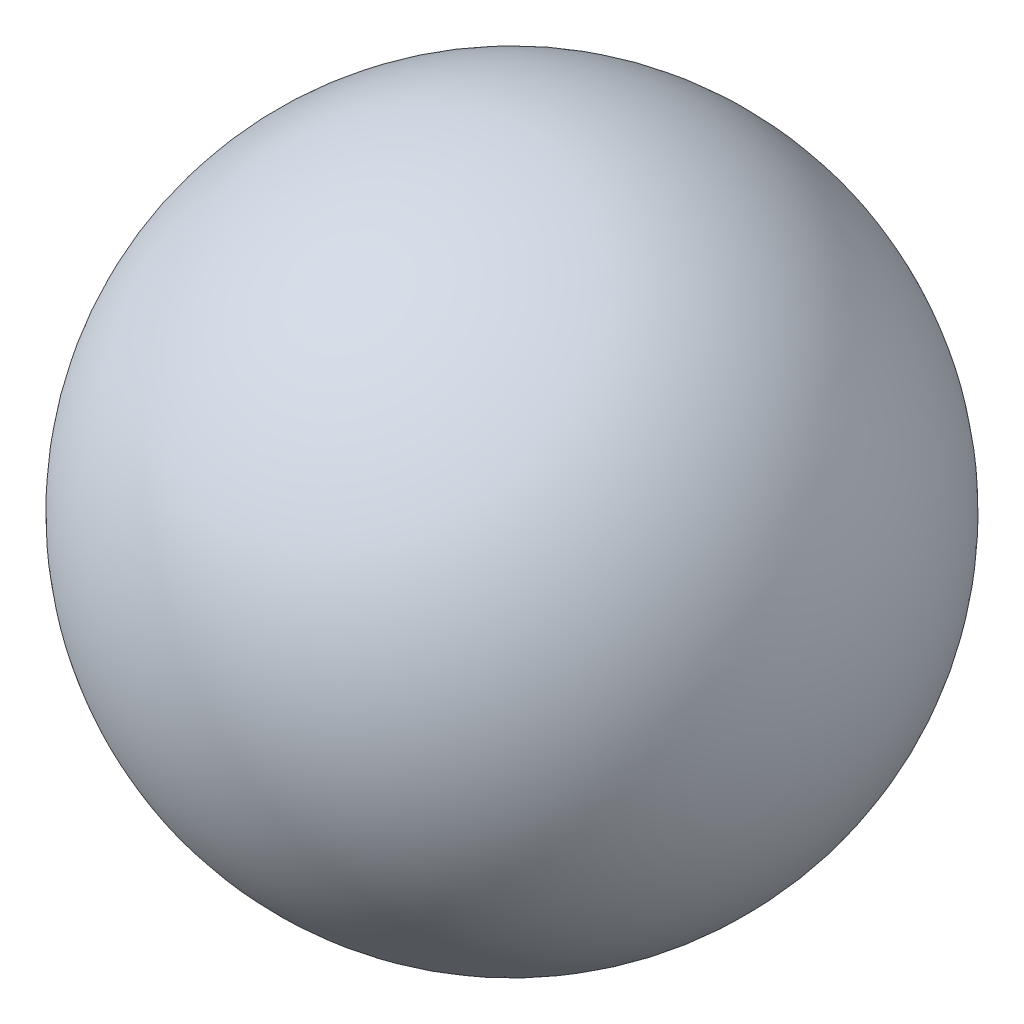
ISO-10303-21;
HEADER;
FILE_DESCRIPTION(('STEP AP214'),'2;1');
FILE_NAME('part.step','',(''),(''),'','','');
FILE_SCHEMA(('AUTOMOTIVE_DESIGN { 1 0 10303 214 1 1 1 1 }'));
ENDSEC;
DATA;
#1=APPLICATION_CONTEXT('core data for automotive mechanical design processes');
#2=APPLICATION_PROTOCOL_DEFINITION('international standard','automotive_design',2000,#1);
#3=PRODUCT_CONTEXT('',#1,'mechanical');
#4=PRODUCT('Part','Part','',(#3));
#5=PRODUCT_RELATED_PRODUCT_CATEGORY('part','',(#4));
#6=PRODUCT_DEFINITION_FORMATION('','',#4);
#7=PRODUCT_DEFINITION_CONTEXT('part definition',#1,'design');
#8=PRODUCT_DEFINITION('design','',#6,#7);
#9=PRODUCT_DEFINITION_SHAPE('','',#8);
#10=(LENGTH_UNIT() NAMED_UNIT(*) SI_UNIT(.MILLI.,.METRE.));
#11=(NAMED_UNIT(*) PLANE_ANGLE_UNIT() SI_UNIT($,.RADIAN.));
#12=(NAMED_UNIT(*) SI_UNIT($,.STERADIAN.) SOLID_ANGLE_UNIT());
#13=UNCERTAINTY_MEASURE_WITH_UNIT(LENGTH_MEASURE(1.E-05),#10,'distance_accuracy_value','');
#14=(GEOMETRIC_REPRESENTATION_CONTEXT(3) GLOBAL_UNCERTAINTY_ASSIGNED_CONTEXT((#13)) GLOBAL_UNIT_ASSIGNED_CONTEXT((#10,
#11,#12)) REPRESENTATION_CONTEXT('',''));
#15=CARTESIAN_POINT('',(0.,0.,0.));
#16=DIRECTION('',(0.,0.,1.));
#17=DIRECTION('',(1.,0.,0.));
#18=AXIS2_PLACEMENT_3D('',#15,#16,#17);
#19=CARTESIAN_POINT('',(0.,0.,0.));
#20=DIRECTION('',(0.,0.,1.));
#21=DIRECTION('',(0.,1.,0.));
#22=AXIS2_PLACEMENT_3D('',#19,#20,#21);
#23=SPHERICAL_SURFACE('',#22,2.35);
#24=CARTESIAN_POINT('',(0.,0.,2.35));
#25=VERTEX_POINT('',#24);
#26=VERTEX_LOOP('',#25);
#27=FACE_BOUND('',#26,.T.);
#28=ADVANCED_FACE('F29',(#27),#23,.T.);
#29=CLOSED_SHELL('',(#28));
#30=MANIFOLD_SOLID_BREP('B2',#29);
#31=ADVANCED_BREP_SHAPE_REPRESENTATION('',(#18,#30),#14);
#32=SHAPE_DEFINITION_REPRESENTATION(#9,#31);
ENDSEC;
END-ISO-10303-21;
